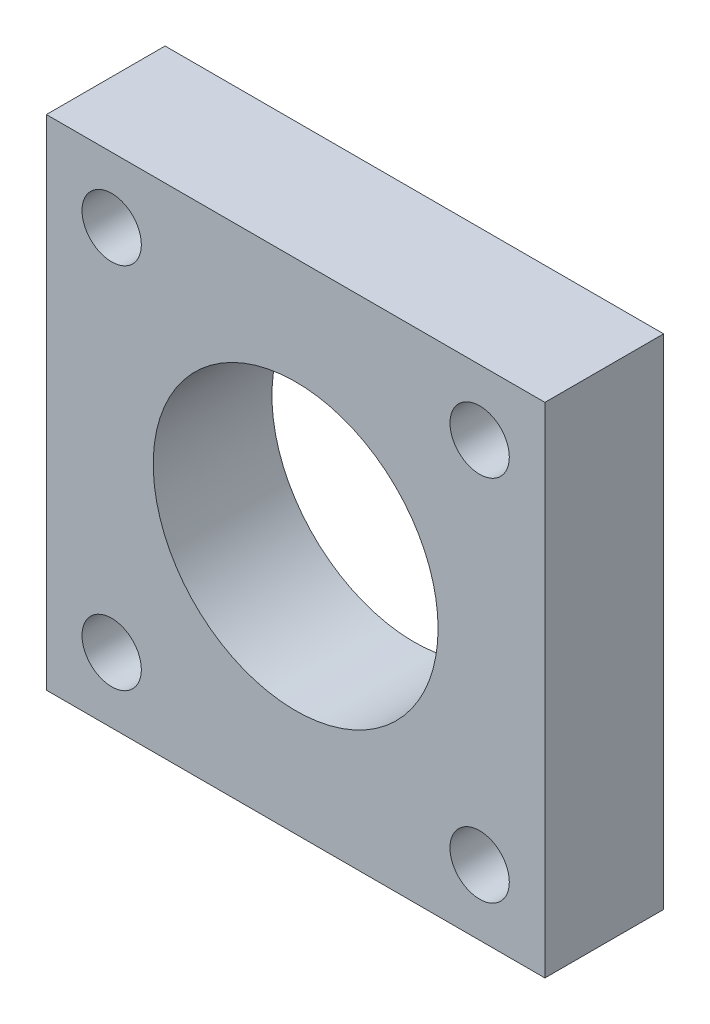
ISO-10303-21;
HEADER;
FILE_DESCRIPTION(('STEP AP214'),'2;1');
FILE_NAME('part.step','',(''),(''),'','','');
FILE_SCHEMA(('AUTOMOTIVE_DESIGN { 1 0 10303 214 1 1 1 1 }'));
ENDSEC;
DATA;
#1=APPLICATION_CONTEXT('core data for automotive mechanical design processes');
#2=APPLICATION_PROTOCOL_DEFINITION('international standard','automotive_design',2000,#1);
#3=PRODUCT_CONTEXT('',#1,'mechanical');
#4=PRODUCT('Part','Part','',(#3));
#5=PRODUCT_RELATED_PRODUCT_CATEGORY('part','',(#4));
#6=PRODUCT_DEFINITION_FORMATION('','',#4);
#7=PRODUCT_DEFINITION_CONTEXT('part definition',#1,'design');
#8=PRODUCT_DEFINITION('design','',#6,#7);
#9=PRODUCT_DEFINITION_SHAPE('','',#8);
#10=(LENGTH_UNIT() NAMED_UNIT(*) SI_UNIT(.MILLI.,.METRE.));
#11=(NAMED_UNIT(*) PLANE_ANGLE_UNIT() SI_UNIT($,.RADIAN.));
#12=(NAMED_UNIT(*) SI_UNIT($,.STERADIAN.) SOLID_ANGLE_UNIT());
#13=UNCERTAINTY_MEASURE_WITH_UNIT(LENGTH_MEASURE(1.E-05),#10,'distance_accuracy_value','');
#14=(GEOMETRIC_REPRESENTATION_CONTEXT(3) GLOBAL_UNCERTAINTY_ASSIGNED_CONTEXT((#13)) GLOBAL_UNIT_ASSIGNED_CONTEXT((#10,
#11,#12)) REPRESENTATION_CONTEXT('',''));
#15=CARTESIAN_POINT('',(0.,0.,0.));
#16=DIRECTION('',(0.,0.,1.));
#17=DIRECTION('',(1.,0.,0.));
#18=AXIS2_PLACEMENT_3D('',#15,#16,#17);
#19=CARTESIAN_POINT('',(-28.3012757229893,16.325771917764,10.));
#20=DIRECTION('',(1.,0.,0.));
#21=DIRECTION('',(0.,0.,-1.));
#22=AXIS2_PLACEMENT_3D('',#19,#20,#21);
#23=PLANE('',#22);
#24=CARTESIAN_POINT('',(-28.3012757229893,4.32577191776396,4.));
#25=DIRECTION('',(-1.,0.,0.));
#26=DIRECTION('',(0.,0.,1.));
#27=AXIS2_PLACEMENT_3D('',#24,#25,#26);
#28=CIRCLE('',#27,2.025);
#29=CARTESIAN_POINT('',(-28.3012757229893,4.32577191776396,6.025));
#30=VERTEX_POINT('',#29);
#31=EDGE_CURVE('E109',#30,#30,#28,.T.);
#32=ORIENTED_EDGE('',*,*,#31,.F.);
#33=EDGE_LOOP('',(#32));
#34=FACE_BOUND('',#33,.T.);
#35=DIRECTION('',(0.,-1.,0.));
#36=VECTOR('',#35,1.);
#37=CARTESIAN_POINT('',(-28.3012757229893,16.325771917764,0.));
#38=LINE('',#37,#36);
#39=CARTESIAN_POINT('',(-28.3012757229893,16.325771917764,0.));
#40=VERTEX_POINT('',#39);
#41=CARTESIAN_POINT('',(-28.3012757229893,-25.674228082236,0.));
#42=VERTEX_POINT('',#41);
#43=EDGE_CURVE('E146',#40,#42,#38,.T.);
#44=ORIENTED_EDGE('',*,*,#43,.T.);
#45=DIRECTION('',(0.,0.,-1.));
#46=VECTOR('',#45,1.);
#47=CARTESIAN_POINT('',(-28.3012757229893,-25.674228082236,10.));
#48=LINE('',#47,#46);
#49=CARTESIAN_POINT('',(-28.3012757229893,-25.674228082236,10.));
#50=VERTEX_POINT('',#49);
#51=EDGE_CURVE('E11',#50,#42,#48,.T.);
#52=ORIENTED_EDGE('',*,*,#51,.F.);
#53=DIRECTION('',(0.,-1.,0.));
#54=VECTOR('',#53,1.);
#55=CARTESIAN_POINT('',(-28.3012757229893,16.325771917764,10.));
#56=LINE('',#55,#54);
#57=CARTESIAN_POINT('',(-28.3012757229893,16.325771917764,10.));
#58=VERTEX_POINT('',#57);
#59=EDGE_CURVE('E149',#58,#50,#56,.T.);
#60=ORIENTED_EDGE('',*,*,#59,.F.);
#61=DIRECTION('',(0.,0.,-1.));
#62=VECTOR('',#61,1.);
#63=CARTESIAN_POINT('',(-28.3012757229893,16.325771917764,10.));
#64=LINE('',#63,#62);
#65=EDGE_CURVE('E155',#58,#40,#64,.T.);
#66=ORIENTED_EDGE('',*,*,#65,.T.);
#67=EDGE_LOOP('',(#44,#52,#60,#66));
#68=FACE_BOUND('',#67,.T.);
#69=CARTESIAN_POINT('',(-28.3012757229893,-13.674228082236,4.));
#70=DIRECTION('',(-1.,0.,0.));
#71=DIRECTION('',(0.,0.,1.));
#72=AXIS2_PLACEMENT_3D('',#69,#70,#71);
#73=CIRCLE('',#72,2.025);
#74=CARTESIAN_POINT('',(-28.3012757229893,-13.674228082236,6.025));
#75=VERTEX_POINT('',#74);
#76=EDGE_CURVE('E102',#75,#75,#73,.T.);
#77=ORIENTED_EDGE('',*,*,#76,.F.);
#78=EDGE_LOOP('',(#77));
#79=FACE_BOUND('',#78,.T.);
#80=ADVANCED_FACE('F38',(#34,#68,#79),#23,.F.);
#81=CARTESIAN_POINT('',(0.,0.,10.));
#82=DIRECTION('',(0.,0.,1.));
#83=DIRECTION('',(1.,0.,0.));
#84=AXIS2_PLACEMENT_3D('',#81,#82,#83);
#85=PLANE('',#84);
#86=CARTESIAN_POINT('',(-22.8012757229893,-20.174228082236,10.));
#87=DIRECTION('',(0.,0.,1.));
#88=DIRECTION('',(1.,0.,0.));
#89=AXIS2_PLACEMENT_3D('',#86,#87,#88);
#90=CIRCLE('',#89,2.5);
#91=CARTESIAN_POINT('',(-20.3012757229893,-20.174228082236,10.));
#92=VERTEX_POINT('',#91);
#93=EDGE_CURVE('E125',#92,#92,#90,.T.);
#94=ORIENTED_EDGE('',*,*,#93,.F.);
#95=EDGE_LOOP('',(#94));
#96=FACE_BOUND('',#95,.T.);
#97=CARTESIAN_POINT('',(-22.8012757229893,10.825771917764,10.));
#98=DIRECTION('',(0.,0.,1.));
#99=DIRECTION('',(1.,0.,0.));
#100=AXIS2_PLACEMENT_3D('',#97,#98,#99);
#101=CIRCLE('',#100,2.5);
#102=CARTESIAN_POINT('',(-20.3012757229893,10.825771917764,10.));
#103=VERTEX_POINT('',#102);
#104=EDGE_CURVE('E137',#103,#103,#101,.T.);
#105=ORIENTED_EDGE('',*,*,#104,.F.);
#106=EDGE_LOOP('',(#105));
#107=FACE_BOUND('',#106,.T.);
#108=ORIENTED_EDGE('',*,*,#59,.T.);
#109=DIRECTION('',(1.,0.,0.));
#110=VECTOR('',#109,1.);
#111=CARTESIAN_POINT('',(-28.3012757229893,-25.674228082236,10.));
#112=LINE('',#111,#110);
#113=CARTESIAN_POINT('',(13.6987242770107,-25.674228082236,10.));
#114=VERTEX_POINT('',#113);
#115=EDGE_CURVE('E85',#50,#114,#112,.T.);
#116=ORIENTED_EDGE('',*,*,#115,.T.);
#117=DIRECTION('',(0.,1.,0.));
#118=VECTOR('',#117,1.);
#119=CARTESIAN_POINT('',(13.6987242770107,16.325771917764,10.));
#120=LINE('',#119,#118);
#121=CARTESIAN_POINT('',(13.6987242770107,16.325771917764,10.));
#122=VERTEX_POINT('',#121);
#123=EDGE_CURVE('E152',#114,#122,#120,.T.);
#124=ORIENTED_EDGE('',*,*,#123,.T.);
#125=DIRECTION('',(-1.,0.,0.));
#126=VECTOR('',#125,1.);
#127=CARTESIAN_POINT('',(-28.3012757229893,16.325771917764,10.));
#128=LINE('',#127,#126);
#129=EDGE_CURVE('E54',#122,#58,#128,.T.);
#130=ORIENTED_EDGE('',*,*,#129,.T.);
#131=EDGE_LOOP('',(#108,#116,#124,#130));
#132=FACE_BOUND('',#131,.T.);
#133=CARTESIAN_POINT('',(-7.30127572298932,-4.67422808223604,10.));
#134=DIRECTION('',(0.,0.,1.));
#135=DIRECTION('',(1.,0.,0.));
#136=AXIS2_PLACEMENT_3D('',#133,#134,#135);
#137=CIRCLE('',#136,12.);
#138=CARTESIAN_POINT('',(4.69872427701068,-4.67422808223604,10.));
#139=VERTEX_POINT('',#138);
#140=EDGE_CURVE('E143',#139,#139,#137,.T.);
#141=ORIENTED_EDGE('',*,*,#140,.F.);
#142=EDGE_LOOP('',(#141));
#143=FACE_BOUND('',#142,.T.);
#144=CARTESIAN_POINT('',(8.19872427701068,10.825771917764,10.));
#145=DIRECTION('',(0.,0.,1.));
#146=DIRECTION('',(1.,0.,0.));
#147=AXIS2_PLACEMENT_3D('',#144,#145,#146);
#148=CIRCLE('',#147,2.5);
#149=CARTESIAN_POINT('',(10.6987242770107,10.825771917764,10.));
#150=VERTEX_POINT('',#149);
#151=EDGE_CURVE('E131',#150,#150,#148,.T.);
#152=ORIENTED_EDGE('',*,*,#151,.F.);
#153=EDGE_LOOP('',(#152));
#154=FACE_BOUND('',#153,.T.);
#155=CARTESIAN_POINT('',(8.19872427701068,-20.174228082236,10.));
#156=DIRECTION('',(0.,0.,1.));
#157=DIRECTION('',(1.,0.,0.));
#158=AXIS2_PLACEMENT_3D('',#155,#156,#157);
#159=CIRCLE('',#158,2.5);
#160=CARTESIAN_POINT('',(10.6987242770107,-20.174228082236,10.));
#161=VERTEX_POINT('',#160);
#162=EDGE_CURVE('E119',#161,#161,#159,.T.);
#163=ORIENTED_EDGE('',*,*,#162,.F.);
#164=EDGE_LOOP('',(#163));
#165=FACE_BOUND('',#164,.T.);
#166=ADVANCED_FACE('F189',(#96,#107,#132,#143,#154,#165),#85,.T.);
#167=CARTESIAN_POINT('',(0.,0.,0.));
#168=DIRECTION('',(0.,0.,1.));
#169=DIRECTION('',(1.,0.,0.));
#170=AXIS2_PLACEMENT_3D('',#167,#168,#169);
#171=PLANE('',#170);
#172=ORIENTED_EDGE('',*,*,#43,.F.);
#173=DIRECTION('',(-1.,0.,0.));
#174=VECTOR('',#173,1.);
#175=CARTESIAN_POINT('',(-28.3012757229893,16.325771917764,0.));
#176=LINE('',#175,#174);
#177=CARTESIAN_POINT('',(13.6987242770107,16.325771917764,0.));
#178=VERTEX_POINT('',#177);
#179=EDGE_CURVE('E78',#178,#40,#176,.T.);
#180=ORIENTED_EDGE('',*,*,#179,.F.);
#181=DIRECTION('',(0.,1.,0.));
#182=VECTOR('',#181,1.);
#183=CARTESIAN_POINT('',(13.6987242770107,16.325771917764,0.));
#184=LINE('',#183,#182);
#185=CARTESIAN_POINT('',(13.6987242770107,-25.674228082236,0.));
#186=VERTEX_POINT('',#185);
#187=EDGE_CURVE('E72',#186,#178,#184,.T.);
#188=ORIENTED_EDGE('',*,*,#187,.F.);
#189=DIRECTION('',(1.,0.,0.));
#190=VECTOR('',#189,1.);
#191=CARTESIAN_POINT('',(-28.3012757229893,-25.674228082236,0.));
#192=LINE('',#191,#190);
#193=EDGE_CURVE('E158',#42,#186,#192,.T.);
#194=ORIENTED_EDGE('',*,*,#193,.F.);
#195=EDGE_LOOP('',(#172,#180,#188,#194));
#196=FACE_BOUND('',#195,.T.);
#197=CARTESIAN_POINT('',(-7.30127572298932,-4.67422808223604,0.));
#198=DIRECTION('',(0.,0.,1.));
#199=DIRECTION('',(1.,0.,0.));
#200=AXIS2_PLACEMENT_3D('',#197,#198,#199);
#201=CIRCLE('',#200,12.);
#202=CARTESIAN_POINT('',(4.69872427701068,-4.67422808223604,0.));
#203=VERTEX_POINT('',#202);
#204=EDGE_CURVE('E140',#203,#203,#201,.T.);
#205=ORIENTED_EDGE('',*,*,#204,.T.);
#206=EDGE_LOOP('',(#205));
#207=FACE_BOUND('',#206,.T.);
#208=CARTESIAN_POINT('',(-22.8012757229893,10.825771917764,0.));
#209=DIRECTION('',(0.,0.,1.));
#210=DIRECTION('',(1.,0.,0.));
#211=AXIS2_PLACEMENT_3D('',#208,#209,#210);
#212=CIRCLE('',#211,2.5);
#213=CARTESIAN_POINT('',(-20.3012757229893,10.825771917764,0.));
#214=VERTEX_POINT('',#213);
#215=EDGE_CURVE('E134',#214,#214,#212,.T.);
#216=ORIENTED_EDGE('',*,*,#215,.T.);
#217=EDGE_LOOP('',(#216));
#218=FACE_BOUND('',#217,.T.);
#219=CARTESIAN_POINT('',(8.19872427701068,10.825771917764,0.));
#220=DIRECTION('',(0.,0.,1.));
#221=DIRECTION('',(1.,0.,0.));
#222=AXIS2_PLACEMENT_3D('',#219,#220,#221);
#223=CIRCLE('',#222,2.5);
#224=CARTESIAN_POINT('',(10.6987242770107,10.825771917764,0.));
#225=VERTEX_POINT('',#224);
#226=EDGE_CURVE('E128',#225,#225,#223,.T.);
#227=ORIENTED_EDGE('',*,*,#226,.T.);
#228=EDGE_LOOP('',(#227));
#229=FACE_BOUND('',#228,.T.);
#230=CARTESIAN_POINT('',(-22.8012757229893,-20.174228082236,0.));
#231=DIRECTION('',(0.,0.,1.));
#232=DIRECTION('',(1.,0.,0.));
#233=AXIS2_PLACEMENT_3D('',#230,#231,#232);
#234=CIRCLE('',#233,2.5);
#235=CARTESIAN_POINT('',(-20.3012757229893,-20.174228082236,0.));
#236=VERTEX_POINT('',#235);
#237=EDGE_CURVE('E122',#236,#236,#234,.T.);
#238=ORIENTED_EDGE('',*,*,#237,.T.);
#239=EDGE_LOOP('',(#238));
#240=FACE_BOUND('',#239,.T.);
#241=CARTESIAN_POINT('',(8.19872427701068,-20.174228082236,0.));
#242=DIRECTION('',(0.,0.,1.));
#243=DIRECTION('',(1.,0.,0.));
#244=AXIS2_PLACEMENT_3D('',#241,#242,#243);
#245=CIRCLE('',#244,2.5);
#246=CARTESIAN_POINT('',(10.6987242770107,-20.174228082236,0.));
#247=VERTEX_POINT('',#246);
#248=EDGE_CURVE('E118',#247,#247,#245,.T.);
#249=ORIENTED_EDGE('',*,*,#248,.T.);
#250=EDGE_LOOP('',(#249));
#251=FACE_BOUND('',#250,.T.);
#252=ADVANCED_FACE('F168',(#196,#207,#218,#229,#240,#251),#171,.F.);
#253=CARTESIAN_POINT('',(-28.3012757229893,-25.674228082236,10.));
#254=DIRECTION('',(0.,1.,0.));
#255=DIRECTION('',(0.,0.,1.));
#256=AXIS2_PLACEMENT_3D('',#253,#254,#255);
#257=PLANE('',#256);
#258=ORIENTED_EDGE('',*,*,#193,.T.);
#259=DIRECTION('',(0.,0.,-1.));
#260=VECTOR('',#259,1.);
#261=CARTESIAN_POINT('',(13.6987242770107,-25.674228082236,10.));
#262=LINE('',#261,#260);
#263=EDGE_CURVE('E46',#114,#186,#262,.T.);
#264=ORIENTED_EDGE('',*,*,#263,.F.);
#265=ORIENTED_EDGE('',*,*,#115,.F.);
#266=ORIENTED_EDGE('',*,*,#51,.T.);
#267=EDGE_LOOP('',(#258,#264,#265,#266));
#268=FACE_BOUND('',#267,.T.);
#269=ADVANCED_FACE('F185',(#268),#257,.F.);
#270=CARTESIAN_POINT('',(13.6987242770107,16.325771917764,10.));
#271=DIRECTION('',(-1.,0.,0.));
#272=DIRECTION('',(0.,-1.,0.));
#273=AXIS2_PLACEMENT_3D('',#270,#271,#272);
#274=PLANE('',#273);
#275=ORIENTED_EDGE('',*,*,#187,.T.);
#276=DIRECTION('',(0.,0.,-1.));
#277=VECTOR('',#276,1.);
#278=CARTESIAN_POINT('',(13.6987242770107,16.325771917764,10.));
#279=LINE('',#278,#277);
#280=EDGE_CURVE('E163',#122,#178,#279,.T.);
#281=ORIENTED_EDGE('',*,*,#280,.F.);
#282=ORIENTED_EDGE('',*,*,#123,.F.);
#283=ORIENTED_EDGE('',*,*,#263,.T.);
#284=EDGE_LOOP('',(#275,#281,#282,#283));
#285=FACE_BOUND('',#284,.T.);
#286=ADVANCED_FACE('F165',(#285),#274,.F.);
#287=CARTESIAN_POINT('',(-28.3012757229893,16.325771917764,10.));
#288=DIRECTION('',(0.,-1.,0.));
#289=DIRECTION('',(1.,0.,0.));
#290=AXIS2_PLACEMENT_3D('',#287,#288,#289);
#291=PLANE('',#290);
#292=ORIENTED_EDGE('',*,*,#179,.T.);
#293=ORIENTED_EDGE('',*,*,#65,.F.);
#294=ORIENTED_EDGE('',*,*,#129,.F.);
#295=ORIENTED_EDGE('',*,*,#280,.T.);
#296=EDGE_LOOP('',(#292,#293,#294,#295));
#297=FACE_BOUND('',#296,.T.);
#298=ADVANCED_FACE('F174',(#297),#291,.F.);
#299=CARTESIAN_POINT('',(-7.30127572298932,-4.67422808223604,10.));
#300=DIRECTION('',(0.,0.,-1.));
#301=DIRECTION('',(-1.,0.,0.));
#302=AXIS2_PLACEMENT_3D('',#299,#300,#301);
#303=CYLINDRICAL_SURFACE('',#302,12.);
#304=ORIENTED_EDGE('',*,*,#140,.T.);
#305=EDGE_LOOP('',(#304));
#306=FACE_BOUND('',#305,.T.);
#307=ORIENTED_EDGE('',*,*,#204,.F.);
#308=EDGE_LOOP('',(#307));
#309=FACE_BOUND('',#308,.T.);
#310=ADVANCED_FACE('F176',(#306,#309),#303,.F.);
#311=CARTESIAN_POINT('',(-22.8012757229893,10.825771917764,10.));
#312=DIRECTION('',(0.,0.,-1.));
#313=DIRECTION('',(-1.,0.,0.));
#314=AXIS2_PLACEMENT_3D('',#311,#312,#313);
#315=CYLINDRICAL_SURFACE('',#314,2.5);
#316=ORIENTED_EDGE('',*,*,#104,.T.);
#317=EDGE_LOOP('',(#316));
#318=FACE_BOUND('',#317,.T.);
#319=ORIENTED_EDGE('',*,*,#215,.F.);
#320=EDGE_LOOP('',(#319));
#321=FACE_BOUND('',#320,.T.);
#322=ADVANCED_FACE('F182',(#318,#321),#315,.F.);
#323=CARTESIAN_POINT('',(8.19872427701068,10.825771917764,10.));
#324=DIRECTION('',(0.,0.,-1.));
#325=DIRECTION('',(-1.,0.,0.));
#326=AXIS2_PLACEMENT_3D('',#323,#324,#325);
#327=CYLINDRICAL_SURFACE('',#326,2.5);
#328=ORIENTED_EDGE('',*,*,#151,.T.);
#329=EDGE_LOOP('',(#328));
#330=FACE_BOUND('',#329,.T.);
#331=ORIENTED_EDGE('',*,*,#226,.F.);
#332=EDGE_LOOP('',(#331));
#333=FACE_BOUND('',#332,.T.);
#334=ADVANCED_FACE('F227',(#330,#333),#327,.F.);
#335=CARTESIAN_POINT('',(-22.8012757229893,-20.174228082236,10.));
#336=DIRECTION('',(0.,0.,-1.));
#337=DIRECTION('',(-1.,0.,0.));
#338=AXIS2_PLACEMENT_3D('',#335,#336,#337);
#339=CYLINDRICAL_SURFACE('',#338,2.5);
#340=ORIENTED_EDGE('',*,*,#93,.T.);
#341=EDGE_LOOP('',(#340));
#342=FACE_BOUND('',#341,.T.);
#343=ORIENTED_EDGE('',*,*,#237,.F.);
#344=EDGE_LOOP('',(#343));
#345=FACE_BOUND('',#344,.T.);
#346=ADVANCED_FACE('F223',(#342,#345),#339,.F.);
#347=CARTESIAN_POINT('',(8.19872427701068,-20.174228082236,10.));
#348=DIRECTION('',(0.,0.,-1.));
#349=DIRECTION('',(-1.,0.,0.));
#350=AXIS2_PLACEMENT_3D('',#347,#348,#349);
#351=CYLINDRICAL_SURFACE('',#350,2.5);
#352=ORIENTED_EDGE('',*,*,#162,.T.);
#353=EDGE_LOOP('',(#352));
#354=FACE_BOUND('',#353,.T.);
#355=ORIENTED_EDGE('',*,*,#248,.F.);
#356=EDGE_LOOP('',(#355));
#357=FACE_BOUND('',#356,.T.);
#358=ADVANCED_FACE('F219',(#354,#357),#351,.F.);
#359=CARTESIAN_POINT('',(-16.8012757229893,-13.674228082236,4.));
#360=DIRECTION('',(-1.,0.,0.));
#361=DIRECTION('',(0.,0.,1.));
#362=AXIS2_PLACEMENT_3D('',#359,#360,#361);
#363=CONICAL_SURFACE('',#362,1.64999999999999,1.02974425867665);
#364=CARTESIAN_POINT('',(-15.8098557015938,-13.674228082236,4.));
#365=VERTEX_POINT('',#364);
#366=VERTEX_LOOP('',#365);
#367=FACE_BOUND('',#366,.T.);
#368=CARTESIAN_POINT('',(-16.8012757229893,-13.674228082236,4.));
#369=DIRECTION('',(-1.,0.,0.));
#370=DIRECTION('',(0.,0.,1.));
#371=AXIS2_PLACEMENT_3D('',#368,#369,#370);
#372=CIRCLE('',#371,1.64999999999999);
#373=CARTESIAN_POINT('',(-16.8012757229893,-13.674228082236,5.64999999999999));
#374=VERTEX_POINT('',#373);
#375=EDGE_CURVE('E115',#374,#374,#372,.T.);
#376=ORIENTED_EDGE('',*,*,#375,.T.);
#377=EDGE_LOOP('',(#376));
#378=FACE_BOUND('',#377,.T.);
#379=ADVANCED_FACE('F215',(#367,#378),#363,.F.);
#380=CARTESIAN_POINT('',(-28.3012757229893,-13.674228082236,4.));
#381=DIRECTION('',(-1.,0.,0.));
#382=DIRECTION('',(0.,0.,1.));
#383=AXIS2_PLACEMENT_3D('',#380,#381,#382);
#384=CYLINDRICAL_SURFACE('',#383,1.64999999999999);
#385=ORIENTED_EDGE('',*,*,#375,.F.);
#386=EDGE_LOOP('',(#385));
#387=FACE_BOUND('',#386,.T.);
#388=CARTESIAN_POINT('',(-27.9262757229893,-13.674228082236,4.));
#389=DIRECTION('',(-1.,0.,0.));
#390=DIRECTION('',(0.,0.,1.));
#391=AXIS2_PLACEMENT_3D('',#388,#389,#390);
#392=CIRCLE('',#391,1.65);
#393=CARTESIAN_POINT('',(-27.9262757229893,-13.674228082236,5.65));
#394=VERTEX_POINT('',#393);
#395=EDGE_CURVE('E106',#394,#394,#392,.T.);
#396=ORIENTED_EDGE('',*,*,#395,.T.);
#397=EDGE_LOOP('',(#396));
#398=FACE_BOUND('',#397,.T.);
#399=ADVANCED_FACE('F211',(#387,#398),#384,.F.);
#400=CARTESIAN_POINT('',(-28.3012757229893,-13.674228082236,4.));
#401=DIRECTION('',(-1.,0.,0.));
#402=DIRECTION('',(0.,0.,1.));
#403=AXIS2_PLACEMENT_3D('',#400,#401,#402);
#404=CONICAL_SURFACE('',#403,2.025,0.785398163397444);
#405=ORIENTED_EDGE('',*,*,#395,.F.);
#406=EDGE_LOOP('',(#405));
#407=FACE_BOUND('',#406,.T.);
#408=ORIENTED_EDGE('',*,*,#76,.T.);
#409=EDGE_LOOP('',(#408));
#410=FACE_BOUND('',#409,.T.);
#411=ADVANCED_FACE('F96',(#407,#410),#404,.F.);
#412=CARTESIAN_POINT('',(-16.8012757229893,4.32577191776396,4.));
#413=DIRECTION('',(-1.,0.,0.));
#414=DIRECTION('',(0.,0.,1.));
#415=AXIS2_PLACEMENT_3D('',#412,#413,#414);
#416=CONICAL_SURFACE('',#415,1.64999999999999,1.02974425867665);
#417=CARTESIAN_POINT('',(-15.8098557015938,4.32577191776395,4.));
#418=VERTEX_POINT('',#417);
#419=VERTEX_LOOP('',#418);
#420=FACE_BOUND('',#419,.T.);
#421=CARTESIAN_POINT('',(-16.8012757229893,4.32577191776396,4.));
#422=DIRECTION('',(-1.,0.,0.));
#423=DIRECTION('',(0.,0.,1.));
#424=AXIS2_PLACEMENT_3D('',#421,#422,#423);
#425=CIRCLE('',#424,1.64999999999999);
#426=CARTESIAN_POINT('',(-16.8012757229893,4.32577191776396,5.64999999999999));
#427=VERTEX_POINT('',#426);
#428=EDGE_CURVE('E100',#427,#427,#425,.T.);
#429=ORIENTED_EDGE('',*,*,#428,.T.);
#430=EDGE_LOOP('',(#429));
#431=FACE_BOUND('',#430,.T.);
#432=ADVANCED_FACE('F92',(#420,#431),#416,.F.);
#433=CARTESIAN_POINT('',(-28.3012757229893,4.32577191776396,4.));
#434=DIRECTION('',(-1.,0.,0.));
#435=DIRECTION('',(0.,0.,1.));
#436=AXIS2_PLACEMENT_3D('',#433,#434,#435);
#437=CYLINDRICAL_SURFACE('',#436,1.64999999999999);
#438=ORIENTED_EDGE('',*,*,#428,.F.);
#439=EDGE_LOOP('',(#438));
#440=FACE_BOUND('',#439,.T.);
#441=CARTESIAN_POINT('',(-27.9262757229893,4.32577191776396,4.));
#442=DIRECTION('',(-1.,0.,0.));
#443=DIRECTION('',(0.,0.,1.));
#444=AXIS2_PLACEMENT_3D('',#441,#442,#443);
#445=CIRCLE('',#444,1.65);
#446=CARTESIAN_POINT('',(-27.9262757229893,4.32577191776396,5.65));
#447=VERTEX_POINT('',#446);
#448=EDGE_CURVE('E103',#447,#447,#445,.T.);
#449=ORIENTED_EDGE('',*,*,#448,.T.);
#450=EDGE_LOOP('',(#449));
#451=FACE_BOUND('',#450,.T.);
#452=ADVANCED_FACE('F95',(#440,#451),#437,.F.);
#453=CARTESIAN_POINT('',(-28.3012757229893,4.32577191776396,4.));
#454=DIRECTION('',(-1.,0.,0.));
#455=DIRECTION('',(0.,0.,1.));
#456=AXIS2_PLACEMENT_3D('',#453,#454,#455);
#457=CONICAL_SURFACE('',#456,2.025,0.785398163397444);
#458=ORIENTED_EDGE('',*,*,#448,.F.);
#459=EDGE_LOOP('',(#458));
#460=FACE_BOUND('',#459,.T.);
#461=ORIENTED_EDGE('',*,*,#31,.T.);
#462=EDGE_LOOP('',(#461));
#463=FACE_BOUND('',#462,.T.);
#464=ADVANCED_FACE('F199',(#460,#463),#457,.F.);
#465=CLOSED_SHELL('',(#80,#166,#252,#269,#286,#298,#310,#322,#334,#346,#358,#379,#399,#411,#432,
#452,#464));
#466=MANIFOLD_SOLID_BREP('B2',#465);
#467=ADVANCED_BREP_SHAPE_REPRESENTATION('',(#18,#466),#14);
#468=SHAPE_DEFINITION_REPRESENTATION(#9,#467);
ENDSEC;
END-ISO-10303-21;
